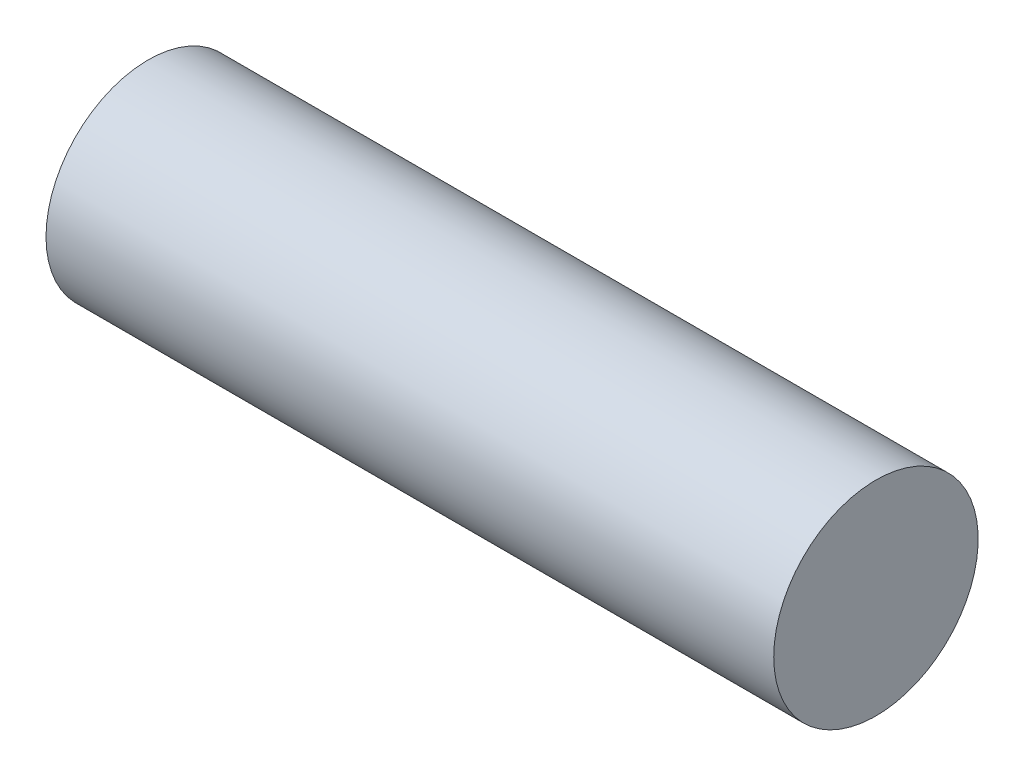
ISO-10303-21;
HEADER;
FILE_DESCRIPTION(('STEP AP214'),'2;1');
FILE_NAME('part.step','',(''),(''),'','','');
FILE_SCHEMA(('AUTOMOTIVE_DESIGN { 1 0 10303 214 1 1 1 1 }'));
ENDSEC;
DATA;
#1=APPLICATION_CONTEXT('core data for automotive mechanical design processes');
#2=APPLICATION_PROTOCOL_DEFINITION('international standard','automotive_design',2000,#1);
#3=PRODUCT_CONTEXT('',#1,'mechanical');
#4=PRODUCT('Part','Part','',(#3));
#5=PRODUCT_RELATED_PRODUCT_CATEGORY('part','',(#4));
#6=PRODUCT_DEFINITION_FORMATION('','',#4);
#7=PRODUCT_DEFINITION_CONTEXT('part definition',#1,'design');
#8=PRODUCT_DEFINITION('design','',#6,#7);
#9=PRODUCT_DEFINITION_SHAPE('','',#8);
#10=(LENGTH_UNIT() NAMED_UNIT(*) SI_UNIT(.MILLI.,.METRE.));
#11=(NAMED_UNIT(*) PLANE_ANGLE_UNIT() SI_UNIT($,.RADIAN.));
#12=(NAMED_UNIT(*) SI_UNIT($,.STERADIAN.) SOLID_ANGLE_UNIT());
#13=UNCERTAINTY_MEASURE_WITH_UNIT(LENGTH_MEASURE(1.E-05),#10,'distance_accuracy_value','');
#14=(GEOMETRIC_REPRESENTATION_CONTEXT(3) GLOBAL_UNCERTAINTY_ASSIGNED_CONTEXT((#13)) GLOBAL_UNIT_ASSIGNED_CONTEXT((#10,
#11,#12)) REPRESENTATION_CONTEXT('',''));
#15=CARTESIAN_POINT('',(0.,0.,0.));
#16=DIRECTION('',(0.,0.,1.));
#17=DIRECTION('',(1.,0.,0.));
#18=AXIS2_PLACEMENT_3D('',#15,#16,#17);
#19=CARTESIAN_POINT('',(-34.19184593609,26.1982859355306,-61.8572076554759));
#20=DIRECTION('',(-1.,0.,0.));
#21=DIRECTION('',(0.,0.,1.));
#22=AXIS2_PLACEMENT_3D('',#19,#20,#21);
#23=PLANE('',#22);
#24=CARTESIAN_POINT('',(-34.1918459360899,26.1982859355306,-61.8572076554759));
#25=DIRECTION('',(-1.,0.,0.));
#26=DIRECTION('',(0.,0.,1.));
#27=AXIS2_PLACEMENT_3D('',#24,#25,#26);
#28=CIRCLE('',#27,44.271024872523);
#29=CARTESIAN_POINT('',(-34.1918459360899,26.1982859355306,-17.5861827829529));
#30=VERTEX_POINT('',#29);
#31=EDGE_CURVE('E10',#30,#30,#28,.T.);
#32=ORIENTED_EDGE('',*,*,#31,.F.);
#33=EDGE_LOOP('',(#32));
#34=FACE_BOUND('',#33,.T.);
#35=ADVANCED_FACE('F35',(#34),#23,.F.);
#36=CARTESIAN_POINT('',(-349.381032960558,26.1982859355306,-61.8572076554759));
#37=DIRECTION('',(-1.,0.,0.));
#38=DIRECTION('',(0.,0.,1.));
#39=AXIS2_PLACEMENT_3D('',#36,#37,#38);
#40=CYLINDRICAL_SURFACE('',#39,44.271024872523);
#41=CARTESIAN_POINT('',(-349.381032960558,26.1982859355306,-61.8572076554759));
#42=DIRECTION('',(-1.,0.,0.));
#43=DIRECTION('',(0.,0.,1.));
#44=AXIS2_PLACEMENT_3D('',#41,#42,#43);
#45=CIRCLE('',#44,44.271024872523);
#46=CARTESIAN_POINT('',(-349.381032960558,26.1982859355306,-17.5861827829529));
#47=VERTEX_POINT('',#46);
#48=EDGE_CURVE('E42',#47,#47,#45,.T.);
#49=ORIENTED_EDGE('',*,*,#48,.F.);
#50=EDGE_LOOP('',(#49));
#51=FACE_BOUND('',#50,.T.);
#52=ORIENTED_EDGE('',*,*,#31,.T.);
#53=EDGE_LOOP('',(#52));
#54=FACE_BOUND('',#53,.T.);
#55=ADVANCED_FACE('F50',(#51,#54),#40,.T.);
#56=CARTESIAN_POINT('',(-349.381032960558,26.1982859355306,-106.128232527999));
#57=DIRECTION('',(1.,0.,0.));
#58=DIRECTION('',(0.,0.,-1.));
#59=AXIS2_PLACEMENT_3D('',#56,#57,#58);
#60=PLANE('',#59);
#61=ORIENTED_EDGE('',*,*,#48,.T.);
#62=EDGE_LOOP('',(#61));
#63=FACE_BOUND('',#62,.T.);
#64=ADVANCED_FACE('F48',(#63),#60,.F.);
#65=CLOSED_SHELL('',(#35,#55,#64));
#66=MANIFOLD_SOLID_BREP('B2',#65);
#67=ADVANCED_BREP_SHAPE_REPRESENTATION('',(#18,#66),#14);
#68=SHAPE_DEFINITION_REPRESENTATION(#9,#67);
ENDSEC;
END-ISO-10303-21;
